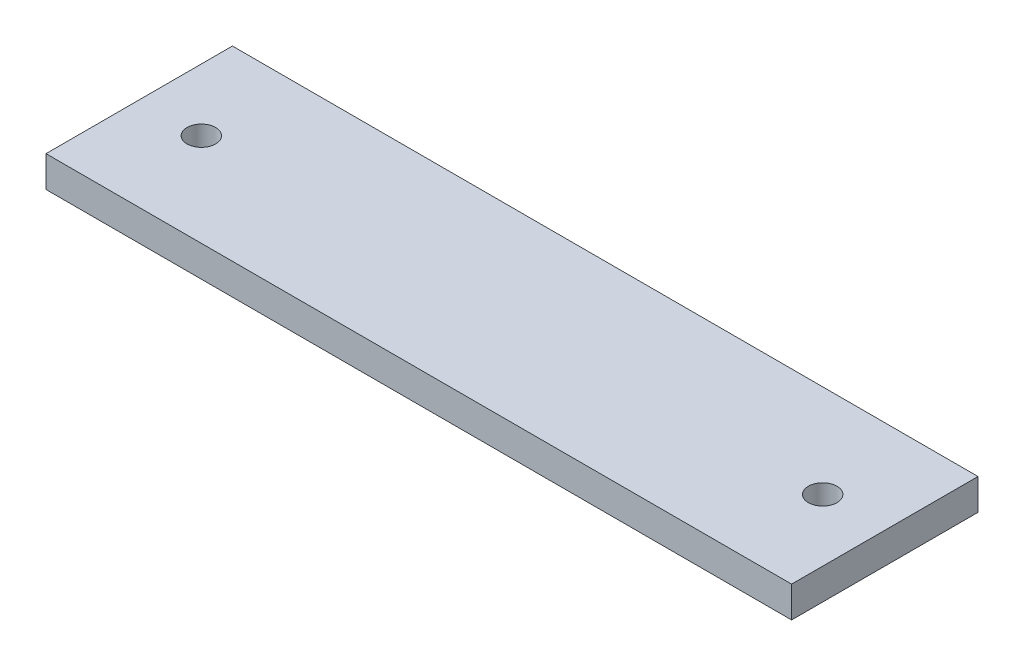
ISO-10303-21;
HEADER;
FILE_DESCRIPTION(('STEP AP214'),'2;1');
FILE_NAME('part.step','',(''),(''),'','','');
FILE_SCHEMA(('AUTOMOTIVE_DESIGN { 1 0 10303 214 1 1 1 1 }'));
ENDSEC;
DATA;
#1=APPLICATION_CONTEXT('core data for automotive mechanical design processes');
#2=APPLICATION_PROTOCOL_DEFINITION('international standard','automotive_design',2000,#1);
#3=PRODUCT_CONTEXT('',#1,'mechanical');
#4=PRODUCT('Part','Part','',(#3));
#5=PRODUCT_RELATED_PRODUCT_CATEGORY('part','',(#4));
#6=PRODUCT_DEFINITION_FORMATION('','',#4);
#7=PRODUCT_DEFINITION_CONTEXT('part definition',#1,'design');
#8=PRODUCT_DEFINITION('design','',#6,#7);
#9=PRODUCT_DEFINITION_SHAPE('','',#8);
#10=(LENGTH_UNIT() NAMED_UNIT(*) SI_UNIT(.MILLI.,.METRE.));
#11=(NAMED_UNIT(*) PLANE_ANGLE_UNIT() SI_UNIT($,.RADIAN.));
#12=(NAMED_UNIT(*) SI_UNIT($,.STERADIAN.) SOLID_ANGLE_UNIT());
#13=UNCERTAINTY_MEASURE_WITH_UNIT(LENGTH_MEASURE(1.E-05),#10,'distance_accuracy_value','');
#14=(GEOMETRIC_REPRESENTATION_CONTEXT(3) GLOBAL_UNCERTAINTY_ASSIGNED_CONTEXT((#13)) GLOBAL_UNIT_ASSIGNED_CONTEXT((#10,
#11,#12)) REPRESENTATION_CONTEXT('',''));
#15=CARTESIAN_POINT('',(0.,0.,0.));
#16=DIRECTION('',(0.,0.,1.));
#17=DIRECTION('',(1.,0.,0.));
#18=AXIS2_PLACEMENT_3D('',#15,#16,#17);
#19=CARTESIAN_POINT('',(0.,3.175,0.));
#20=DIRECTION('',(0.,-1.,0.));
#21=DIRECTION('',(0.,0.,-1.));
#22=AXIS2_PLACEMENT_3D('',#19,#20,#21);
#23=PLANE('',#22);
#24=DIRECTION('',(-1.,0.,0.));
#25=VECTOR('',#24,1.);
#26=CARTESIAN_POINT('',(0.,3.175,-19.05));
#27=LINE('',#26,#25);
#28=CARTESIAN_POINT('',(177.8,3.175,-19.05));
#29=VERTEX_POINT('',#28);
#30=CARTESIAN_POINT('',(101.6,3.175,-19.05));
#31=VERTEX_POINT('',#30);
#32=EDGE_CURVE('E89',#29,#31,#27,.T.);
#33=ORIENTED_EDGE('',*,*,#32,.T.);
#34=DIRECTION('',(0.,0.,-1.));
#35=VECTOR('',#34,1.);
#36=CARTESIAN_POINT('',(101.6,3.175,0.));
#37=LINE('',#36,#35);
#38=CARTESIAN_POINT('',(101.6,3.175,0.));
#39=VERTEX_POINT('',#38);
#40=EDGE_CURVE('E54',#39,#31,#37,.T.);
#41=ORIENTED_EDGE('',*,*,#40,.F.);
#42=DIRECTION('',(1.,0.,0.));
#43=VECTOR('',#42,1.);
#44=CARTESIAN_POINT('',(0.,3.175,0.));
#45=LINE('',#44,#43);
#46=CARTESIAN_POINT('',(177.8,3.175,0.));
#47=VERTEX_POINT('',#46);
#48=EDGE_CURVE('E95',#39,#47,#45,.T.);
#49=ORIENTED_EDGE('',*,*,#48,.T.);
#50=DIRECTION('',(0.,0.,-1.));
#51=VECTOR('',#50,1.);
#52=CARTESIAN_POINT('',(177.8,3.175,0.));
#53=LINE('',#52,#51);
#54=EDGE_CURVE('E63',#47,#29,#53,.T.);
#55=ORIENTED_EDGE('',*,*,#54,.T.);
#56=EDGE_LOOP('',(#33,#41,#49,#55));
#57=FACE_BOUND('',#56,.T.);
#58=CARTESIAN_POINT('',(107.95,3.175,-9.525));
#59=DIRECTION('',(0.,1.,0.));
#60=DIRECTION('',(0.,0.,1.));
#61=AXIS2_PLACEMENT_3D('',#58,#59,#60);
#62=CIRCLE('',#61,1.4605);
#63=CARTESIAN_POINT('',(107.95,3.175,-8.0645));
#64=VERTEX_POINT('',#63);
#65=EDGE_CURVE('E100',#64,#64,#62,.T.);
#66=ORIENTED_EDGE('',*,*,#65,.F.);
#67=EDGE_LOOP('',(#66));
#68=FACE_BOUND('',#67,.T.);
#69=CARTESIAN_POINT('',(171.45,3.175,-9.525));
#70=DIRECTION('',(0.,1.,0.));
#71=DIRECTION('',(0.,0.,1.));
#72=AXIS2_PLACEMENT_3D('',#69,#70,#71);
#73=CIRCLE('',#72,1.4605);
#74=CARTESIAN_POINT('',(171.45,3.175,-8.0645));
#75=VERTEX_POINT('',#74);
#76=EDGE_CURVE('E106',#75,#75,#73,.T.);
#77=ORIENTED_EDGE('',*,*,#76,.F.);
#78=EDGE_LOOP('',(#77));
#79=FACE_BOUND('',#78,.T.);
#80=ADVANCED_FACE('F39',(#57,#68,#79),#23,.F.);
#81=CARTESIAN_POINT('',(0.,0.,0.));
#82=DIRECTION('',(0.,-1.,0.));
#83=DIRECTION('',(0.,0.,-1.));
#84=AXIS2_PLACEMENT_3D('',#81,#82,#83);
#85=PLANE('',#84);
#86=DIRECTION('',(0.,0.,-1.));
#87=VECTOR('',#86,1.);
#88=CARTESIAN_POINT('',(101.6,0.,0.));
#89=LINE('',#88,#87);
#90=CARTESIAN_POINT('',(101.6,0.,0.));
#91=VERTEX_POINT('',#90);
#92=CARTESIAN_POINT('',(101.6,0.,-19.05));
#93=VERTEX_POINT('',#92);
#94=EDGE_CURVE('E94',#91,#93,#89,.T.);
#95=ORIENTED_EDGE('',*,*,#94,.T.);
#96=DIRECTION('',(-1.,0.,0.));
#97=VECTOR('',#96,1.);
#98=CARTESIAN_POINT('',(0.,0.,-19.05));
#99=LINE('',#98,#97);
#100=CARTESIAN_POINT('',(177.8,0.,-19.05));
#101=VERTEX_POINT('',#100);
#102=EDGE_CURVE('E83',#101,#93,#99,.T.);
#103=ORIENTED_EDGE('',*,*,#102,.F.);
#104=DIRECTION('',(0.,0.,-1.));
#105=VECTOR('',#104,1.);
#106=CARTESIAN_POINT('',(177.8,0.,0.));
#107=LINE('',#106,#105);
#108=CARTESIAN_POINT('',(177.8,0.,0.));
#109=VERTEX_POINT('',#108);
#110=EDGE_CURVE('E75',#109,#101,#107,.T.);
#111=ORIENTED_EDGE('',*,*,#110,.F.);
#112=DIRECTION('',(1.,0.,0.));
#113=VECTOR('',#112,1.);
#114=CARTESIAN_POINT('',(0.,0.,0.));
#115=LINE('',#114,#113);
#116=EDGE_CURVE('E84',#91,#109,#115,.T.);
#117=ORIENTED_EDGE('',*,*,#116,.F.);
#118=EDGE_LOOP('',(#95,#103,#111,#117));
#119=FACE_BOUND('',#118,.T.);
#120=CARTESIAN_POINT('',(107.95,0.,-9.525));
#121=DIRECTION('',(0.,1.,0.));
#122=DIRECTION('',(0.,0.,1.));
#123=AXIS2_PLACEMENT_3D('',#120,#121,#122);
#124=CIRCLE('',#123,1.4605);
#125=CARTESIAN_POINT('',(107.95,0.,-8.0645));
#126=VERTEX_POINT('',#125);
#127=EDGE_CURVE('E103',#126,#126,#124,.T.);
#128=ORIENTED_EDGE('',*,*,#127,.T.);
#129=EDGE_LOOP('',(#128));
#130=FACE_BOUND('',#129,.T.);
#131=CARTESIAN_POINT('',(171.45,0.,-9.525));
#132=DIRECTION('',(0.,1.,0.));
#133=DIRECTION('',(0.,0.,1.));
#134=AXIS2_PLACEMENT_3D('',#131,#132,#133);
#135=CIRCLE('',#134,1.4605);
#136=CARTESIAN_POINT('',(171.45,0.,-8.0645));
#137=VERTEX_POINT('',#136);
#138=EDGE_CURVE('E109',#137,#137,#135,.T.);
#139=ORIENTED_EDGE('',*,*,#138,.T.);
#140=EDGE_LOOP('',(#139));
#141=FACE_BOUND('',#140,.T.);
#142=ADVANCED_FACE('F91',(#119,#130,#141),#85,.T.);
#143=CARTESIAN_POINT('',(0.,3.175,0.));
#144=DIRECTION('',(0.,0.,-1.));
#145=DIRECTION('',(-1.,0.,0.));
#146=AXIS2_PLACEMENT_3D('',#143,#144,#145);
#147=PLANE('',#146);
#148=ORIENTED_EDGE('',*,*,#48,.F.);
#149=DIRECTION('',(0.,1.,0.));
#150=VECTOR('',#149,1.);
#151=CARTESIAN_POINT('',(101.6,0.,0.));
#152=LINE('',#151,#150);
#153=EDGE_CURVE('E115',#91,#39,#152,.T.);
#154=ORIENTED_EDGE('',*,*,#153,.F.);
#155=ORIENTED_EDGE('',*,*,#116,.T.);
#156=DIRECTION('',(0.,-1.,0.));
#157=VECTOR('',#156,1.);
#158=CARTESIAN_POINT('',(177.8,3.175,0.));
#159=LINE('',#158,#157);
#160=EDGE_CURVE('E11',#47,#109,#159,.T.);
#161=ORIENTED_EDGE('',*,*,#160,.F.);
#162=EDGE_LOOP('',(#148,#154,#155,#161));
#163=FACE_BOUND('',#162,.T.);
#164=ADVANCED_FACE('F41',(#163),#147,.F.);
#165=CARTESIAN_POINT('',(177.8,3.175,0.));
#166=DIRECTION('',(-1.,0.,0.));
#167=DIRECTION('',(0.,0.,1.));
#168=AXIS2_PLACEMENT_3D('',#165,#166,#167);
#169=PLANE('',#168);
#170=ORIENTED_EDGE('',*,*,#110,.T.);
#171=DIRECTION('',(0.,-1.,0.));
#172=VECTOR('',#171,1.);
#173=CARTESIAN_POINT('',(177.8,3.175,-19.05));
#174=LINE('',#173,#172);
#175=EDGE_CURVE('E47',#29,#101,#174,.T.);
#176=ORIENTED_EDGE('',*,*,#175,.F.);
#177=ORIENTED_EDGE('',*,*,#54,.F.);
#178=ORIENTED_EDGE('',*,*,#160,.T.);
#179=EDGE_LOOP('',(#170,#176,#177,#178));
#180=FACE_BOUND('',#179,.T.);
#181=ADVANCED_FACE('F77',(#180),#169,.F.);
#182=CARTESIAN_POINT('',(0.,3.175,-19.05));
#183=DIRECTION('',(0.,0.,1.));
#184=DIRECTION('',(1.,0.,0.));
#185=AXIS2_PLACEMENT_3D('',#182,#183,#184);
#186=PLANE('',#185);
#187=ORIENTED_EDGE('',*,*,#102,.T.);
#188=DIRECTION('',(0.,1.,0.));
#189=VECTOR('',#188,1.);
#190=CARTESIAN_POINT('',(101.6,0.,-19.05));
#191=LINE('',#190,#189);
#192=EDGE_CURVE('E112',#93,#31,#191,.T.);
#193=ORIENTED_EDGE('',*,*,#192,.T.);
#194=ORIENTED_EDGE('',*,*,#32,.F.);
#195=ORIENTED_EDGE('',*,*,#175,.T.);
#196=EDGE_LOOP('',(#187,#193,#194,#195));
#197=FACE_BOUND('',#196,.T.);
#198=ADVANCED_FACE('F88',(#197),#186,.F.);
#199=CARTESIAN_POINT('',(107.95,3.175,-9.525));
#200=DIRECTION('',(0.,-1.,0.));
#201=DIRECTION('',(0.,0.,-1.));
#202=AXIS2_PLACEMENT_3D('',#199,#200,#201);
#203=CYLINDRICAL_SURFACE('',#202,1.4605);
#204=ORIENTED_EDGE('',*,*,#65,.T.);
#205=EDGE_LOOP('',(#204));
#206=FACE_BOUND('',#205,.T.);
#207=ORIENTED_EDGE('',*,*,#127,.F.);
#208=EDGE_LOOP('',(#207));
#209=FACE_BOUND('',#208,.T.);
#210=ADVANCED_FACE('F135',(#206,#209),#203,.F.);
#211=CARTESIAN_POINT('',(171.45,3.175,-9.525));
#212=DIRECTION('',(0.,-1.,0.));
#213=DIRECTION('',(0.,0.,-1.));
#214=AXIS2_PLACEMENT_3D('',#211,#212,#213);
#215=CYLINDRICAL_SURFACE('',#214,1.4605);
#216=ORIENTED_EDGE('',*,*,#76,.T.);
#217=EDGE_LOOP('',(#216));
#218=FACE_BOUND('',#217,.T.);
#219=ORIENTED_EDGE('',*,*,#138,.F.);
#220=EDGE_LOOP('',(#219));
#221=FACE_BOUND('',#220,.T.);
#222=ADVANCED_FACE('F129',(#218,#221),#215,.F.);
#223=CARTESIAN_POINT('',(101.6,0.,0.));
#224=DIRECTION('',(1.,0.,0.));
#225=DIRECTION('',(0.,0.,-1.));
#226=AXIS2_PLACEMENT_3D('',#223,#224,#225);
#227=PLANE('',#226);
#228=ORIENTED_EDGE('',*,*,#40,.T.);
#229=ORIENTED_EDGE('',*,*,#192,.F.);
#230=ORIENTED_EDGE('',*,*,#94,.F.);
#231=ORIENTED_EDGE('',*,*,#153,.T.);
#232=EDGE_LOOP('',(#228,#229,#230,#231));
#233=FACE_BOUND('',#232,.T.);
#234=ADVANCED_FACE('F127',(#233),#227,.F.);
#235=CLOSED_SHELL('',(#80,#142,#164,#181,#198,#210,#222,#234));
#236=MANIFOLD_SOLID_BREP('B2',#235);
#237=ADVANCED_BREP_SHAPE_REPRESENTATION('',(#18,#236),#14);
#238=SHAPE_DEFINITION_REPRESENTATION(#9,#237);
ENDSEC;
END-ISO-10303-21;
